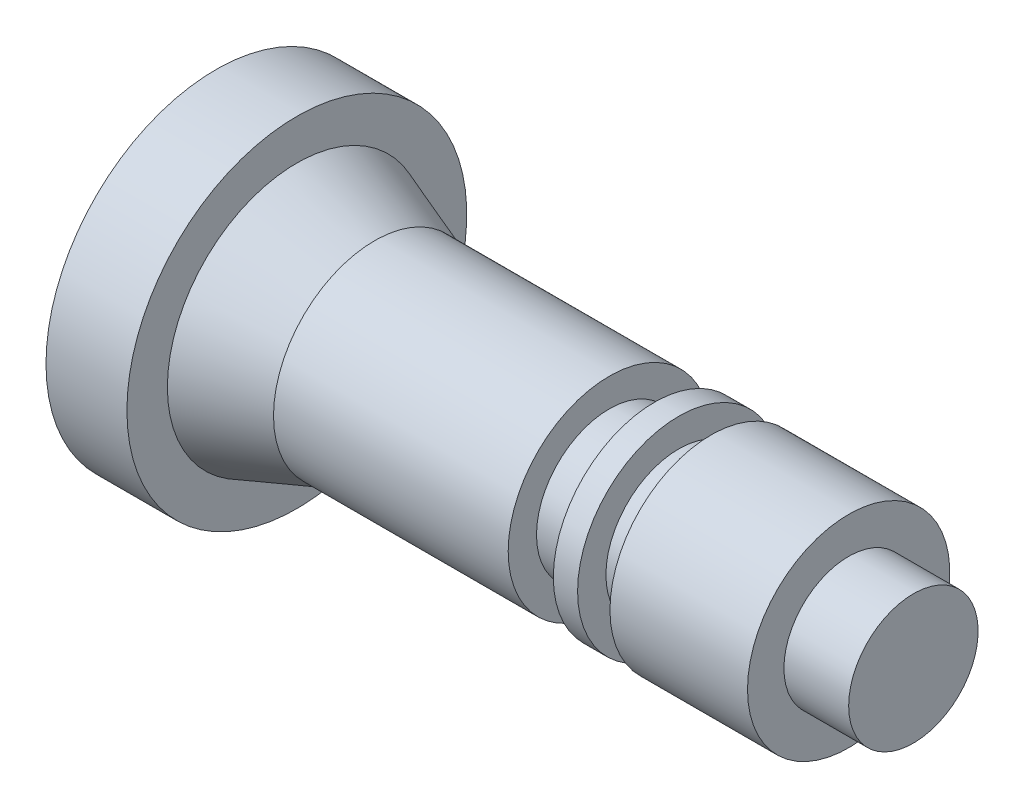
ISO-10303-21;
HEADER;
FILE_DESCRIPTION(('STEP AP214'),'2;1');
FILE_NAME('part.step','',(''),(''),'','','');
FILE_SCHEMA(('AUTOMOTIVE_DESIGN { 1 0 10303 214 1 1 1 1 }'));
ENDSEC;
DATA;
#1=APPLICATION_CONTEXT('core data for automotive mechanical design processes');
#2=APPLICATION_PROTOCOL_DEFINITION('international standard','automotive_design',2000,#1);
#3=PRODUCT_CONTEXT('',#1,'mechanical');
#4=PRODUCT('Part','Part','',(#3));
#5=PRODUCT_RELATED_PRODUCT_CATEGORY('part','',(#4));
#6=PRODUCT_DEFINITION_FORMATION('','',#4);
#7=PRODUCT_DEFINITION_CONTEXT('part definition',#1,'design');
#8=PRODUCT_DEFINITION('design','',#6,#7);
#9=PRODUCT_DEFINITION_SHAPE('','',#8);
#10=(LENGTH_UNIT() NAMED_UNIT(*) SI_UNIT(.MILLI.,.METRE.));
#11=(NAMED_UNIT(*) PLANE_ANGLE_UNIT() SI_UNIT($,.RADIAN.));
#12=(NAMED_UNIT(*) SI_UNIT($,.STERADIAN.) SOLID_ANGLE_UNIT());
#13=UNCERTAINTY_MEASURE_WITH_UNIT(LENGTH_MEASURE(1.E-05),#10,'distance_accuracy_value','');
#14=(GEOMETRIC_REPRESENTATION_CONTEXT(3) GLOBAL_UNCERTAINTY_ASSIGNED_CONTEXT((#13)) GLOBAL_UNIT_ASSIGNED_CONTEXT((#10,
#11,#12)) REPRESENTATION_CONTEXT('',''));
#15=CARTESIAN_POINT('',(0.,0.,0.));
#16=DIRECTION('',(0.,0.,1.));
#17=DIRECTION('',(1.,0.,0.));
#18=AXIS2_PLACEMENT_3D('',#15,#16,#17);
#19=CARTESIAN_POINT('',(0.,0.,0.));
#20=DIRECTION('',(1.,0.,0.));
#21=DIRECTION('',(0.,0.,-1.));
#22=AXIS2_PLACEMENT_3D('',#19,#20,#21);
#23=PLANE('',#22);
#24=CARTESIAN_POINT('',(0.,0.,0.));
#25=DIRECTION('',(-1.,0.,0.));
#26=DIRECTION('',(0.,0.,1.));
#27=AXIS2_PLACEMENT_3D('',#24,#25,#26);
#28=CIRCLE('',#27,21.);
#29=CARTESIAN_POINT('',(0.,0.,21.));
#30=VERTEX_POINT('',#29);
#31=EDGE_CURVE('E10',#30,#30,#28,.T.);
#32=ORIENTED_EDGE('',*,*,#31,.T.);
#33=EDGE_LOOP('',(#32));
#34=FACE_BOUND('',#33,.T.);
#35=ADVANCED_FACE('F35',(#34),#23,.F.);
#36=CARTESIAN_POINT('',(0.,0.,0.));
#37=DIRECTION('',(-1.,0.,0.));
#38=DIRECTION('',(0.,0.,1.));
#39=AXIS2_PLACEMENT_3D('',#36,#37,#38);
#40=CYLINDRICAL_SURFACE('',#39,21.);
#41=ORIENTED_EDGE('',*,*,#31,.F.);
#42=EDGE_LOOP('',(#41));
#43=FACE_BOUND('',#42,.T.);
#44=CARTESIAN_POINT('',(10.,0.,0.));
#45=DIRECTION('',(-1.,0.,0.));
#46=DIRECTION('',(0.,0.,1.));
#47=AXIS2_PLACEMENT_3D('',#44,#45,#46);
#48=CIRCLE('',#47,21.);
#49=CARTESIAN_POINT('',(10.,0.,21.));
#50=VERTEX_POINT('',#49);
#51=EDGE_CURVE('E41',#50,#50,#48,.T.);
#52=ORIENTED_EDGE('',*,*,#51,.T.);
#53=EDGE_LOOP('',(#52));
#54=FACE_BOUND('',#53,.T.);
#55=ADVANCED_FACE('F100',(#43,#54),#40,.T.);
#56=CARTESIAN_POINT('',(10.,21.,0.));
#57=DIRECTION('',(-1.,0.,0.));
#58=DIRECTION('',(0.,0.,1.));
#59=AXIS2_PLACEMENT_3D('',#56,#57,#58);
#60=PLANE('',#59);
#61=ORIENTED_EDGE('',*,*,#51,.F.);
#62=EDGE_LOOP('',(#61));
#63=FACE_BOUND('',#62,.T.);
#64=CARTESIAN_POINT('',(10.,0.,0.));
#65=DIRECTION('',(-1.,0.,0.));
#66=DIRECTION('',(0.,0.,1.));
#67=AXIS2_PLACEMENT_3D('',#64,#65,#66);
#68=CIRCLE('',#67,16.);
#69=CARTESIAN_POINT('',(10.,0.,16.));
#70=VERTEX_POINT('',#69);
#71=EDGE_CURVE('E45',#70,#70,#68,.T.);
#72=ORIENTED_EDGE('',*,*,#71,.T.);
#73=EDGE_LOOP('',(#72));
#74=FACE_BOUND('',#73,.T.);
#75=ADVANCED_FACE('F104',(#63,#74),#60,.F.);
#76=CARTESIAN_POINT('',(19.6161709680912,0.,0.));
#77=DIRECTION('',(-1.,0.,0.));
#78=DIRECTION('',(0.,0.,1.));
#79=AXIS2_PLACEMENT_3D('',#76,#77,#78);
#80=CONICAL_SURFACE('',#79,12.5,0.349065850398867);
#81=ORIENTED_EDGE('',*,*,#71,.F.);
#82=EDGE_LOOP('',(#81));
#83=FACE_BOUND('',#82,.T.);
#84=CARTESIAN_POINT('',(19.6161709680912,0.,0.));
#85=DIRECTION('',(-1.,0.,0.));
#86=DIRECTION('',(0.,0.,1.));
#87=AXIS2_PLACEMENT_3D('',#84,#85,#86);
#88=CIRCLE('',#87,12.5);
#89=CARTESIAN_POINT('',(19.6161709680912,0.,12.5));
#90=VERTEX_POINT('',#89);
#91=EDGE_CURVE('E49',#90,#90,#88,.T.);
#92=ORIENTED_EDGE('',*,*,#91,.T.);
#93=EDGE_LOOP('',(#92));
#94=FACE_BOUND('',#93,.T.);
#95=ADVANCED_FACE('F109',(#83,#94),#80,.T.);
#96=CARTESIAN_POINT('',(0.,0.,0.));
#97=DIRECTION('',(-1.,0.,0.));
#98=DIRECTION('',(0.,0.,1.));
#99=AXIS2_PLACEMENT_3D('',#96,#97,#98);
#100=CYLINDRICAL_SURFACE('',#99,12.5);
#101=ORIENTED_EDGE('',*,*,#91,.F.);
#102=EDGE_LOOP('',(#101));
#103=FACE_BOUND('',#102,.T.);
#104=CARTESIAN_POINT('',(48.6194663812193,0.,0.));
#105=DIRECTION('',(-1.,0.,0.));
#106=DIRECTION('',(0.,0.,1.));
#107=AXIS2_PLACEMENT_3D('',#104,#105,#106);
#108=CIRCLE('',#107,12.5);
#109=CARTESIAN_POINT('',(48.6194663812193,0.,12.5));
#110=VERTEX_POINT('',#109);
#111=EDGE_CURVE('E54',#110,#110,#108,.T.);
#112=ORIENTED_EDGE('',*,*,#111,.T.);
#113=EDGE_LOOP('',(#112));
#114=FACE_BOUND('',#113,.T.);
#115=ADVANCED_FACE('F115',(#103,#114),#100,.T.);
#116=CARTESIAN_POINT('',(48.6194663812193,12.5,0.));
#117=DIRECTION('',(-1.,0.,0.));
#118=DIRECTION('',(0.,0.,1.));
#119=AXIS2_PLACEMENT_3D('',#116,#117,#118);
#120=PLANE('',#119);
#121=ORIENTED_EDGE('',*,*,#111,.F.);
#122=EDGE_LOOP('',(#121));
#123=FACE_BOUND('',#122,.T.);
#124=CARTESIAN_POINT('',(48.6194663812193,0.,0.));
#125=DIRECTION('',(-1.,0.,0.));
#126=DIRECTION('',(0.,0.,1.));
#127=AXIS2_PLACEMENT_3D('',#124,#125,#126);
#128=CIRCLE('',#127,9.);
#129=CARTESIAN_POINT('',(48.6194663812193,0.,9.));
#130=VERTEX_POINT('',#129);
#131=EDGE_CURVE('E57',#130,#130,#128,.T.);
#132=ORIENTED_EDGE('',*,*,#131,.T.);
#133=EDGE_LOOP('',(#132));
#134=FACE_BOUND('',#133,.T.);
#135=ADVANCED_FACE('F119',(#123,#134),#120,.F.);
#136=CARTESIAN_POINT('',(0.,0.,0.));
#137=DIRECTION('',(-1.,0.,0.));
#138=DIRECTION('',(0.,0.,1.));
#139=AXIS2_PLACEMENT_3D('',#136,#137,#138);
#140=CYLINDRICAL_SURFACE('',#139,9.);
#141=ORIENTED_EDGE('',*,*,#131,.F.);
#142=EDGE_LOOP('',(#141));
#143=FACE_BOUND('',#142,.T.);
#144=CARTESIAN_POINT('',(54.1970231914362,0.,0.));
#145=DIRECTION('',(-1.,0.,0.));
#146=DIRECTION('',(0.,0.,1.));
#147=AXIS2_PLACEMENT_3D('',#144,#145,#146);
#148=CIRCLE('',#147,9.);
#149=CARTESIAN_POINT('',(54.1970231914362,0.,9.));
#150=VERTEX_POINT('',#149);
#151=EDGE_CURVE('E60',#150,#150,#148,.T.);
#152=ORIENTED_EDGE('',*,*,#151,.T.);
#153=EDGE_LOOP('',(#152));
#154=FACE_BOUND('',#153,.T.);
#155=ADVANCED_FACE('F123',(#143,#154),#140,.T.);
#156=CARTESIAN_POINT('',(54.1970231914362,9.,0.));
#157=DIRECTION('',(1.,0.,0.));
#158=DIRECTION('',(0.,0.,-1.));
#159=AXIS2_PLACEMENT_3D('',#156,#157,#158);
#160=PLANE('',#159);
#161=ORIENTED_EDGE('',*,*,#151,.F.);
#162=EDGE_LOOP('',(#161));
#163=FACE_BOUND('',#162,.T.);
#164=CARTESIAN_POINT('',(54.1970231914362,0.,0.));
#165=DIRECTION('',(-1.,0.,0.));
#166=DIRECTION('',(0.,0.,1.));
#167=AXIS2_PLACEMENT_3D('',#164,#165,#166);
#168=CIRCLE('',#167,12.5);
#169=CARTESIAN_POINT('',(54.1970231914362,0.,12.5));
#170=VERTEX_POINT('',#169);
#171=EDGE_CURVE('E63',#170,#170,#168,.T.);
#172=ORIENTED_EDGE('',*,*,#171,.T.);
#173=EDGE_LOOP('',(#172));
#174=FACE_BOUND('',#173,.T.);
#175=ADVANCED_FACE('F127',(#163,#174),#160,.F.);
#176=CARTESIAN_POINT('',(0.,0.,0.));
#177=DIRECTION('',(-1.,0.,0.));
#178=DIRECTION('',(0.,0.,1.));
#179=AXIS2_PLACEMENT_3D('',#176,#177,#178);
#180=CYLINDRICAL_SURFACE('',#179,12.5);
#181=ORIENTED_EDGE('',*,*,#171,.F.);
#182=EDGE_LOOP('',(#181));
#183=FACE_BOUND('',#182,.T.);
#184=CARTESIAN_POINT('',(57.1970231914362,0.,0.));
#185=DIRECTION('',(-1.,0.,0.));
#186=DIRECTION('',(0.,0.,1.));
#187=AXIS2_PLACEMENT_3D('',#184,#185,#186);
#188=CIRCLE('',#187,12.5);
#189=CARTESIAN_POINT('',(57.1970231914362,0.,12.5));
#190=VERTEX_POINT('',#189);
#191=EDGE_CURVE('E66',#190,#190,#188,.T.);
#192=ORIENTED_EDGE('',*,*,#191,.T.);
#193=EDGE_LOOP('',(#192));
#194=FACE_BOUND('',#193,.T.);
#195=ADVANCED_FACE('F131',(#183,#194),#180,.T.);
#196=CARTESIAN_POINT('',(57.1970231914362,12.5,0.));
#197=DIRECTION('',(-1.,0.,0.));
#198=DIRECTION('',(0.,0.,1.));
#199=AXIS2_PLACEMENT_3D('',#196,#197,#198);
#200=PLANE('',#199);
#201=ORIENTED_EDGE('',*,*,#191,.F.);
#202=EDGE_LOOP('',(#201));
#203=FACE_BOUND('',#202,.T.);
#204=CARTESIAN_POINT('',(57.1970231914362,0.,0.));
#205=DIRECTION('',(-1.,0.,0.));
#206=DIRECTION('',(0.,0.,1.));
#207=AXIS2_PLACEMENT_3D('',#204,#205,#206);
#208=CIRCLE('',#207,8.99999999999999);
#209=CARTESIAN_POINT('',(57.1970231914362,0.,8.99999999999999));
#210=VERTEX_POINT('',#209);
#211=EDGE_CURVE('E69',#210,#210,#208,.T.);
#212=ORIENTED_EDGE('',*,*,#211,.T.);
#213=EDGE_LOOP('',(#212));
#214=FACE_BOUND('',#213,.T.);
#215=ADVANCED_FACE('F135',(#203,#214),#200,.F.);
#216=CARTESIAN_POINT('',(0.,0.,0.));
#217=DIRECTION('',(-1.,0.,0.));
#218=DIRECTION('',(0.,0.,1.));
#219=AXIS2_PLACEMENT_3D('',#216,#217,#218);
#220=CYLINDRICAL_SURFACE('',#219,8.99999999999999);
#221=ORIENTED_EDGE('',*,*,#211,.F.);
#222=EDGE_LOOP('',(#221));
#223=FACE_BOUND('',#222,.T.);
#224=CARTESIAN_POINT('',(61.1970231914362,0.,0.));
#225=DIRECTION('',(-1.,0.,0.));
#226=DIRECTION('',(0.,0.,1.));
#227=AXIS2_PLACEMENT_3D('',#224,#225,#226);
#228=CIRCLE('',#227,8.99999999999999);
#229=CARTESIAN_POINT('',(61.1970231914362,0.,8.99999999999999));
#230=VERTEX_POINT('',#229);
#231=EDGE_CURVE('E72',#230,#230,#228,.T.);
#232=ORIENTED_EDGE('',*,*,#231,.T.);
#233=EDGE_LOOP('',(#232));
#234=FACE_BOUND('',#233,.T.);
#235=ADVANCED_FACE('F139',(#223,#234),#220,.T.);
#236=CARTESIAN_POINT('',(61.1970231914362,8.99999999999999,0.));
#237=DIRECTION('',(1.,0.,0.));
#238=DIRECTION('',(0.,0.,-1.));
#239=AXIS2_PLACEMENT_3D('',#236,#237,#238);
#240=PLANE('',#239);
#241=ORIENTED_EDGE('',*,*,#231,.F.);
#242=EDGE_LOOP('',(#241));
#243=FACE_BOUND('',#242,.T.);
#244=CARTESIAN_POINT('',(61.1970231914362,0.,0.));
#245=DIRECTION('',(-1.,0.,0.));
#246=DIRECTION('',(0.,0.,1.));
#247=AXIS2_PLACEMENT_3D('',#244,#245,#246);
#248=CIRCLE('',#247,12.5);
#249=CARTESIAN_POINT('',(61.1970231914362,0.,12.5));
#250=VERTEX_POINT('',#249);
#251=EDGE_CURVE('E75',#250,#250,#248,.T.);
#252=ORIENTED_EDGE('',*,*,#251,.T.);
#253=EDGE_LOOP('',(#252));
#254=FACE_BOUND('',#253,.T.);
#255=ADVANCED_FACE('F143',(#243,#254),#240,.F.);
#256=CARTESIAN_POINT('',(0.,0.,0.));
#257=DIRECTION('',(-1.,0.,0.));
#258=DIRECTION('',(0.,0.,1.));
#259=AXIS2_PLACEMENT_3D('',#256,#257,#258);
#260=CYLINDRICAL_SURFACE('',#259,12.5);
#261=ORIENTED_EDGE('',*,*,#251,.F.);
#262=EDGE_LOOP('',(#261));
#263=FACE_BOUND('',#262,.T.);
#264=CARTESIAN_POINT('',(78.1970231914362,0.,0.));
#265=DIRECTION('',(-1.,0.,0.));
#266=DIRECTION('',(0.,0.,1.));
#267=AXIS2_PLACEMENT_3D('',#264,#265,#266);
#268=CIRCLE('',#267,12.5);
#269=CARTESIAN_POINT('',(78.1970231914362,0.,12.5));
#270=VERTEX_POINT('',#269);
#271=EDGE_CURVE('E78',#270,#270,#268,.T.);
#272=ORIENTED_EDGE('',*,*,#271,.T.);
#273=EDGE_LOOP('',(#272));
#274=FACE_BOUND('',#273,.T.);
#275=ADVANCED_FACE('F147',(#263,#274),#260,.T.);
#276=CARTESIAN_POINT('',(78.1970231914362,12.5,0.));
#277=DIRECTION('',(-1.,0.,0.));
#278=DIRECTION('',(0.,0.,1.));
#279=AXIS2_PLACEMENT_3D('',#276,#277,#278);
#280=PLANE('',#279);
#281=ORIENTED_EDGE('',*,*,#271,.F.);
#282=EDGE_LOOP('',(#281));
#283=FACE_BOUND('',#282,.T.);
#284=CARTESIAN_POINT('',(78.1970231914362,0.,0.));
#285=DIRECTION('',(-1.,0.,0.));
#286=DIRECTION('',(0.,0.,1.));
#287=AXIS2_PLACEMENT_3D('',#284,#285,#286);
#288=CIRCLE('',#287,8.);
#289=CARTESIAN_POINT('',(78.1970231914362,0.,8.));
#290=VERTEX_POINT('',#289);
#291=EDGE_CURVE('E81',#290,#290,#288,.T.);
#292=ORIENTED_EDGE('',*,*,#291,.T.);
#293=EDGE_LOOP('',(#292));
#294=FACE_BOUND('',#293,.T.);
#295=ADVANCED_FACE('F96',(#283,#294),#280,.F.);
#296=CARTESIAN_POINT('',(0.,0.,0.));
#297=DIRECTION('',(-1.,0.,0.));
#298=DIRECTION('',(0.,0.,1.));
#299=AXIS2_PLACEMENT_3D('',#296,#297,#298);
#300=CYLINDRICAL_SURFACE('',#299,8.);
#301=ORIENTED_EDGE('',*,*,#291,.F.);
#302=EDGE_LOOP('',(#301));
#303=FACE_BOUND('',#302,.T.);
#304=CARTESIAN_POINT('',(86.1970231914362,0.,0.));
#305=DIRECTION('',(-1.,0.,0.));
#306=DIRECTION('',(0.,0.,1.));
#307=AXIS2_PLACEMENT_3D('',#304,#305,#306);
#308=CIRCLE('',#307,8.);
#309=CARTESIAN_POINT('',(86.1970231914362,0.,8.));
#310=VERTEX_POINT('',#309);
#311=EDGE_CURVE('E84',#310,#310,#308,.T.);
#312=ORIENTED_EDGE('',*,*,#311,.T.);
#313=EDGE_LOOP('',(#312));
#314=FACE_BOUND('',#313,.T.);
#315=ADVANCED_FACE('F88',(#303,#314),#300,.T.);
#316=CARTESIAN_POINT('',(86.1970231914362,8.,0.));
#317=DIRECTION('',(-1.,0.,0.));
#318=DIRECTION('',(0.,0.,1.));
#319=AXIS2_PLACEMENT_3D('',#316,#317,#318);
#320=PLANE('',#319);
#321=ORIENTED_EDGE('',*,*,#311,.F.);
#322=EDGE_LOOP('',(#321));
#323=FACE_BOUND('',#322,.T.);
#324=ADVANCED_FACE('F90',(#323),#320,.F.);
#325=CLOSED_SHELL('',(#35,#55,#75,#95,#115,#135,#155,#175,#195,#215,#235,#255,#275,#295,#315,#324));
#326=MANIFOLD_SOLID_BREP('B2',#325);
#327=ADVANCED_BREP_SHAPE_REPRESENTATION('',(#18,#326),#14);
#328=SHAPE_DEFINITION_REPRESENTATION(#9,#327);
ENDSEC;
END-ISO-10303-21;
